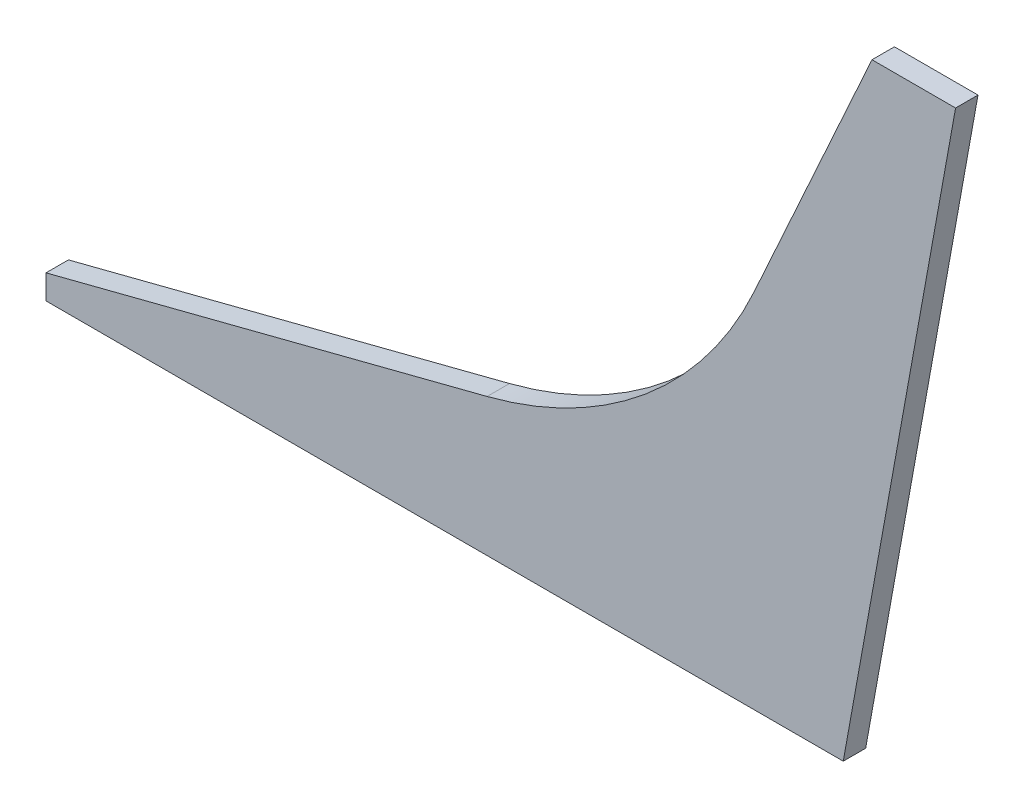
ISO-10303-21;
HEADER;
FILE_DESCRIPTION(('STEP AP214'),'2;1');
FILE_NAME('part.step','',(''),(''),'','','');
FILE_SCHEMA(('AUTOMOTIVE_DESIGN { 1 0 10303 214 1 1 1 1 }'));
ENDSEC;
DATA;
#1=APPLICATION_CONTEXT('core data for automotive mechanical design processes');
#2=APPLICATION_PROTOCOL_DEFINITION('international standard','automotive_design',2000,#1);
#3=PRODUCT_CONTEXT('',#1,'mechanical');
#4=PRODUCT('Part','Part','',(#3));
#5=PRODUCT_RELATED_PRODUCT_CATEGORY('part','',(#4));
#6=PRODUCT_DEFINITION_FORMATION('','',#4);
#7=PRODUCT_DEFINITION_CONTEXT('part definition',#1,'design');
#8=PRODUCT_DEFINITION('design','',#6,#7);
#9=PRODUCT_DEFINITION_SHAPE('','',#8);
#10=(LENGTH_UNIT() NAMED_UNIT(*) SI_UNIT(.MILLI.,.METRE.));
#11=(NAMED_UNIT(*) PLANE_ANGLE_UNIT() SI_UNIT($,.RADIAN.));
#12=(NAMED_UNIT(*) SI_UNIT($,.STERADIAN.) SOLID_ANGLE_UNIT());
#13=UNCERTAINTY_MEASURE_WITH_UNIT(LENGTH_MEASURE(1.E-05),#10,'distance_accuracy_value','');
#14=(GEOMETRIC_REPRESENTATION_CONTEXT(3) GLOBAL_UNCERTAINTY_ASSIGNED_CONTEXT((#13)) GLOBAL_UNIT_ASSIGNED_CONTEXT((#10,
#11,#12)) REPRESENTATION_CONTEXT('',''));
#15=CARTESIAN_POINT('',(0.,0.,0.));
#16=DIRECTION('',(0.,0.,1.));
#17=DIRECTION('',(1.,0.,0.));
#18=AXIS2_PLACEMENT_3D('',#15,#16,#17);
#19=CARTESIAN_POINT('',(307.796379501615,300.319439947959,12.));
#20=DIRECTION('',(0.,-1.,0.));
#21=DIRECTION('',(0.,0.,-1.));
#22=AXIS2_PLACEMENT_3D('',#19,#20,#21);
#23=PLANE('',#22);
#24=DIRECTION('',(-1.,0.,0.));
#25=VECTOR('',#24,1.);
#26=CARTESIAN_POINT('',(307.796379501615,300.319439947959,12.));
#27=LINE('',#26,#25);
#28=CARTESIAN_POINT('',(292.799105883267,300.319439947959,12.));
#29=VERTEX_POINT('',#28);
#30=CARTESIAN_POINT('',(259.257825991577,300.319439947959,12.));
#31=VERTEX_POINT('',#30);
#32=EDGE_CURVE('E91',#29,#31,#27,.T.);
#33=ORIENTED_EDGE('',*,*,#32,.F.);
#34=DIRECTION('',(0.,0.,1.));
#35=VECTOR('',#34,1.);
#36=CARTESIAN_POINT('',(292.799105883267,300.319439947959,3.));
#37=LINE('',#36,#35);
#38=CARTESIAN_POINT('',(292.799105883267,300.319439947959,3.));
#39=VERTEX_POINT('',#38);
#40=EDGE_CURVE('E153',#39,#29,#37,.T.);
#41=ORIENTED_EDGE('',*,*,#40,.F.);
#42=DIRECTION('',(-1.,0.,0.));
#43=VECTOR('',#42,1.);
#44=CARTESIAN_POINT('',(307.796379501615,300.319439947959,3.));
#45=LINE('',#44,#43);
#46=CARTESIAN_POINT('',(259.257825991577,300.319439947959,3.));
#47=VERTEX_POINT('',#46);
#48=EDGE_CURVE('E127',#39,#47,#45,.T.);
#49=ORIENTED_EDGE('',*,*,#48,.T.);
#50=DIRECTION('',(0.,0.,-1.));
#51=VECTOR('',#50,1.);
#52=CARTESIAN_POINT('',(259.257825991577,300.319439947959,12.));
#53=LINE('',#52,#51);
#54=EDGE_CURVE('E11',#31,#47,#53,.T.);
#55=ORIENTED_EDGE('',*,*,#54,.F.);
#56=EDGE_LOOP('',(#33,#41,#49,#55));
#57=FACE_BOUND('',#56,.T.);
#58=ADVANCED_FACE('F35',(#57),#23,.F.);
#59=CARTESIAN_POINT('',(259.257825991577,300.319439947959,12.));
#60=DIRECTION('',(0.910712499489341,-0.413040849400973,0.));
#61=DIRECTION('',(0.413040849400973,0.910712499489341,0.));
#62=AXIS2_PLACEMENT_3D('',#59,#60,#61);
#63=PLANE('',#62);
#64=DIRECTION('',(-0.413040849400973,-0.910712499489341,0.));
#65=VECTOR('',#64,1.);
#66=CARTESIAN_POINT('',(259.257825991577,300.319439947959,3.));
#67=LINE('',#66,#65);
#68=CARTESIAN_POINT('',(211.94799396522,196.00613670536,3.));
#69=VERTEX_POINT('',#68);
#70=EDGE_CURVE('E129',#47,#69,#67,.T.);
#71=ORIENTED_EDGE('',*,*,#70,.T.);
#72=DIRECTION('',(0.,0.,-1.));
#73=VECTOR('',#72,1.);
#74=CARTESIAN_POINT('',(211.94799396522,196.00613670536,12.));
#75=LINE('',#74,#73);
#76=CARTESIAN_POINT('',(211.94799396522,196.00613670536,12.));
#77=VERTEX_POINT('',#76);
#78=EDGE_CURVE('E42',#77,#69,#75,.T.);
#79=ORIENTED_EDGE('',*,*,#78,.F.);
#80=DIRECTION('',(-0.413040849400973,-0.910712499489341,0.));
#81=VECTOR('',#80,1.);
#82=CARTESIAN_POINT('',(259.257825991577,300.319439947959,12.));
#83=LINE('',#82,#81);
#84=EDGE_CURVE('E105',#31,#77,#83,.T.);
#85=ORIENTED_EDGE('',*,*,#84,.F.);
#86=ORIENTED_EDGE('',*,*,#54,.T.);
#87=EDGE_LOOP('',(#71,#79,#85,#86));
#88=FACE_BOUND('',#87,.T.);
#89=ADVANCED_FACE('F170',(#88),#63,.F.);
#90=CARTESIAN_POINT('',(64.4125690479468,262.918754308318,12.));
#91=DIRECTION('',(0.,0.,-1.));
#92=DIRECTION('',(-1.,0.,0.));
#93=AXIS2_PLACEMENT_3D('',#90,#91,#92);
#94=CYLINDRICAL_SURFACE('',#93,162.);
#95=CARTESIAN_POINT('',(64.4125690479468,262.918754308318,3.));
#96=DIRECTION('',(0.,0.,-1.));
#97=DIRECTION('',(-1.,0.,0.));
#98=AXIS2_PLACEMENT_3D('',#95,#96,#97);
#99=CIRCLE('',#98,162.);
#100=CARTESIAN_POINT('',(104.769525475185,106.026064650928,3.));
#101=VERTEX_POINT('',#100);
#102=EDGE_CURVE('E114',#69,#101,#99,.T.);
#103=ORIENTED_EDGE('',*,*,#102,.T.);
#104=DIRECTION('',(0.,0.,-1.));
#105=VECTOR('',#104,1.);
#106=CARTESIAN_POINT('',(104.769525475185,106.026064650928,12.));
#107=LINE('',#106,#105);
#108=CARTESIAN_POINT('',(104.769525475185,106.026064650928,12.));
#109=VERTEX_POINT('',#108);
#110=EDGE_CURVE('E111',#109,#101,#107,.T.);
#111=ORIENTED_EDGE('',*,*,#110,.F.);
#112=CARTESIAN_POINT('',(64.4125690479468,262.918754308318,12.));
#113=DIRECTION('',(0.,0.,-1.));
#114=DIRECTION('',(-1.,0.,0.));
#115=AXIS2_PLACEMENT_3D('',#112,#113,#114);
#116=CIRCLE('',#115,162.);
#117=EDGE_CURVE('E98',#77,#109,#116,.T.);
#118=ORIENTED_EDGE('',*,*,#117,.F.);
#119=ORIENTED_EDGE('',*,*,#78,.T.);
#120=EDGE_LOOP('',(#103,#111,#118,#119));
#121=FACE_BOUND('',#120,.T.);
#122=ADVANCED_FACE('F112',(#121),#94,.F.);
#123=CARTESIAN_POINT('',(104.769525475185,106.026064650928,12.));
#124=DIRECTION('',(0.24911701498295,-0.96847339294685,0.));
#125=DIRECTION('',(0.968473392946851,0.24911701498295,0.));
#126=AXIS2_PLACEMENT_3D('',#123,#124,#125);
#127=PLANE('',#126);
#128=DIRECTION('',(-0.968473392946851,-0.24911701498295,0.));
#129=VECTOR('',#128,1.);
#130=CARTESIAN_POINT('',(104.769525475185,106.026064650928,3.));
#131=LINE('',#130,#129);
#132=CARTESIAN_POINT('',(-72.2794859631339,60.4843682487258,3.));
#133=VERTEX_POINT('',#132);
#134=EDGE_CURVE('E133',#101,#133,#131,.T.);
#135=ORIENTED_EDGE('',*,*,#134,.T.);
#136=DIRECTION('',(0.,0.,-1.));
#137=VECTOR('',#136,1.);
#138=CARTESIAN_POINT('',(-72.2794859631339,60.4843682487258,12.));
#139=LINE('',#138,#137);
#140=CARTESIAN_POINT('',(-72.2794859631339,60.4843682487258,12.));
#141=VERTEX_POINT('',#140);
#142=EDGE_CURVE('E117',#141,#133,#139,.T.);
#143=ORIENTED_EDGE('',*,*,#142,.F.);
#144=DIRECTION('',(-0.968473392946851,-0.24911701498295,0.));
#145=VECTOR('',#144,1.);
#146=CARTESIAN_POINT('',(104.769525475185,106.026064650928,12.));
#147=LINE('',#146,#145);
#148=EDGE_CURVE('E102',#109,#141,#147,.T.);
#149=ORIENTED_EDGE('',*,*,#148,.F.);
#150=ORIENTED_EDGE('',*,*,#110,.T.);
#151=EDGE_LOOP('',(#135,#143,#149,#150));
#152=FACE_BOUND('',#151,.T.);
#153=ADVANCED_FACE('F119',(#152),#127,.F.);
#154=CARTESIAN_POINT('',(-72.2794859631339,60.4843682487258,12.));
#155=DIRECTION('',(1.,0.,0.));
#156=DIRECTION('',(0.,0.,-1.));
#157=AXIS2_PLACEMENT_3D('',#154,#155,#156);
#158=PLANE('',#157);
#159=DIRECTION('',(0.,-1.,0.));
#160=VECTOR('',#159,1.);
#161=CARTESIAN_POINT('',(-72.2794859631339,60.4843682487258,3.));
#162=LINE('',#161,#160);
#163=CARTESIAN_POINT('',(-72.2794859631339,50.7194399479595,3.));
#164=VERTEX_POINT('',#163);
#165=EDGE_CURVE('E83',#133,#164,#162,.T.);
#166=ORIENTED_EDGE('',*,*,#165,.T.);
#167=DIRECTION('',(0.,0.,-1.));
#168=VECTOR('',#167,1.);
#169=CARTESIAN_POINT('',(-72.2794859631339,50.7194399479595,12.));
#170=LINE('',#169,#168);
#171=CARTESIAN_POINT('',(-72.2794859631339,50.7194399479595,12.));
#172=VERTEX_POINT('',#171);
#173=EDGE_CURVE('E123',#172,#164,#170,.T.);
#174=ORIENTED_EDGE('',*,*,#173,.F.);
#175=DIRECTION('',(0.,-1.,0.));
#176=VECTOR('',#175,1.);
#177=CARTESIAN_POINT('',(-72.2794859631339,60.4843682487258,12.));
#178=LINE('',#177,#176);
#179=EDGE_CURVE('E121',#141,#172,#178,.T.);
#180=ORIENTED_EDGE('',*,*,#179,.F.);
#181=ORIENTED_EDGE('',*,*,#142,.T.);
#182=EDGE_LOOP('',(#166,#174,#180,#181));
#183=FACE_BOUND('',#182,.T.);
#184=ADVANCED_FACE('F146',(#183),#158,.F.);
#185=CARTESIAN_POINT('',(-72.2794859631339,50.7194399479595,12.));
#186=DIRECTION('',(0.,1.,0.));
#187=DIRECTION('',(-1.,0.,0.));
#188=AXIS2_PLACEMENT_3D('',#185,#186,#187);
#189=PLANE('',#188);
#190=DIRECTION('',(1.,0.,0.));
#191=VECTOR('',#190,1.);
#192=CARTESIAN_POINT('',(-72.2794859631339,50.7194399479595,3.));
#193=LINE('',#192,#191);
#194=CARTESIAN_POINT('',(247.716431295801,50.7194399479594,3.));
#195=VERTEX_POINT('',#194);
#196=EDGE_CURVE('E136',#164,#195,#193,.T.);
#197=ORIENTED_EDGE('',*,*,#196,.T.);
#198=DIRECTION('',(0.,0.,1.));
#199=VECTOR('',#198,1.);
#200=CARTESIAN_POINT('',(247.716431295801,50.7194399479595,3.));
#201=LINE('',#200,#199);
#202=CARTESIAN_POINT('',(247.716431295801,50.7194399479595,12.));
#203=VERTEX_POINT('',#202);
#204=EDGE_CURVE('E49',#195,#203,#201,.T.);
#205=ORIENTED_EDGE('',*,*,#204,.T.);
#206=DIRECTION('',(1.,0.,0.));
#207=VECTOR('',#206,1.);
#208=CARTESIAN_POINT('',(69.7581402344457,50.7194399479595,12.));
#209=LINE('',#208,#207);
#210=EDGE_CURVE('E57',#172,#203,#209,.T.);
#211=ORIENTED_EDGE('',*,*,#210,.F.);
#212=ORIENTED_EDGE('',*,*,#173,.T.);
#213=EDGE_LOOP('',(#197,#205,#211,#212));
#214=FACE_BOUND('',#213,.T.);
#215=ADVANCED_FACE('F159',(#214),#189,.F.);
#216=CARTESIAN_POINT('',(64.4125690479468,262.918754308318,12.));
#217=DIRECTION('',(0.,0.,-1.));
#218=DIRECTION('',(-1.,0.,0.));
#219=AXIS2_PLACEMENT_3D('',#216,#217,#218);
#220=PLANE('',#219);
#221=ORIENTED_EDGE('',*,*,#210,.T.);
#222=DIRECTION('',(0.177743650661851,0.984076823550579,0.));
#223=VECTOR('',#222,1.);
#224=CARTESIAN_POINT('',(279.04185312537,224.152479584747,12.));
#225=LINE('',#224,#223);
#226=EDGE_CURVE('E130',#203,#29,#225,.T.);
#227=ORIENTED_EDGE('',*,*,#226,.T.);
#228=ORIENTED_EDGE('',*,*,#32,.T.);
#229=ORIENTED_EDGE('',*,*,#84,.T.);
#230=ORIENTED_EDGE('',*,*,#117,.T.);
#231=ORIENTED_EDGE('',*,*,#148,.T.);
#232=ORIENTED_EDGE('',*,*,#179,.T.);
#233=EDGE_LOOP('',(#221,#227,#228,#229,#230,#231,#232));
#234=FACE_BOUND('',#233,.T.);
#235=ADVANCED_FACE('F100',(#234),#220,.F.);
#236=CARTESIAN_POINT('',(64.4125690479468,262.918754308318,3.));
#237=DIRECTION('',(0.,0.,-1.));
#238=DIRECTION('',(-1.,0.,0.));
#239=AXIS2_PLACEMENT_3D('',#236,#237,#238);
#240=PLANE('',#239);
#241=DIRECTION('',(-0.177743650661851,-0.984076823550579,0.));
#242=VECTOR('',#241,1.);
#243=CARTESIAN_POINT('',(247.716431295801,50.7194399479595,3.));
#244=LINE('',#243,#242);
#245=EDGE_CURVE('E156',#39,#195,#244,.T.);
#246=ORIENTED_EDGE('',*,*,#245,.T.);
#247=ORIENTED_EDGE('',*,*,#196,.F.);
#248=ORIENTED_EDGE('',*,*,#165,.F.);
#249=ORIENTED_EDGE('',*,*,#134,.F.);
#250=ORIENTED_EDGE('',*,*,#102,.F.);
#251=ORIENTED_EDGE('',*,*,#70,.F.);
#252=ORIENTED_EDGE('',*,*,#48,.F.);
#253=EDGE_LOOP('',(#246,#247,#248,#249,#250,#251,#252));
#254=FACE_BOUND('',#253,.T.);
#255=ADVANCED_FACE('F143',(#254),#240,.T.);
#256=CARTESIAN_POINT('',(247.716431295801,50.7194399479595,3.));
#257=DIRECTION('',(-0.984076823550579,0.177743650661851,0.));
#258=DIRECTION('',(-0.177743650661851,-0.984076823550579,0.));
#259=AXIS2_PLACEMENT_3D('',#256,#257,#258);
#260=PLANE('',#259);
#261=ORIENTED_EDGE('',*,*,#204,.F.);
#262=ORIENTED_EDGE('',*,*,#245,.F.);
#263=ORIENTED_EDGE('',*,*,#40,.T.);
#264=ORIENTED_EDGE('',*,*,#226,.F.);
#265=EDGE_LOOP('',(#261,#262,#263,#264));
#266=FACE_BOUND('',#265,.T.);
#267=ADVANCED_FACE('F175',(#266),#260,.F.);
#268=CLOSED_SHELL('',(#58,#89,#122,#153,#184,#215,#235,#255,#267));
#269=MANIFOLD_SOLID_BREP('B2',#268);
#270=ADVANCED_BREP_SHAPE_REPRESENTATION('',(#18,#269),#14);
#271=SHAPE_DEFINITION_REPRESENTATION(#9,#270);
ENDSEC;
END-ISO-10303-21;
